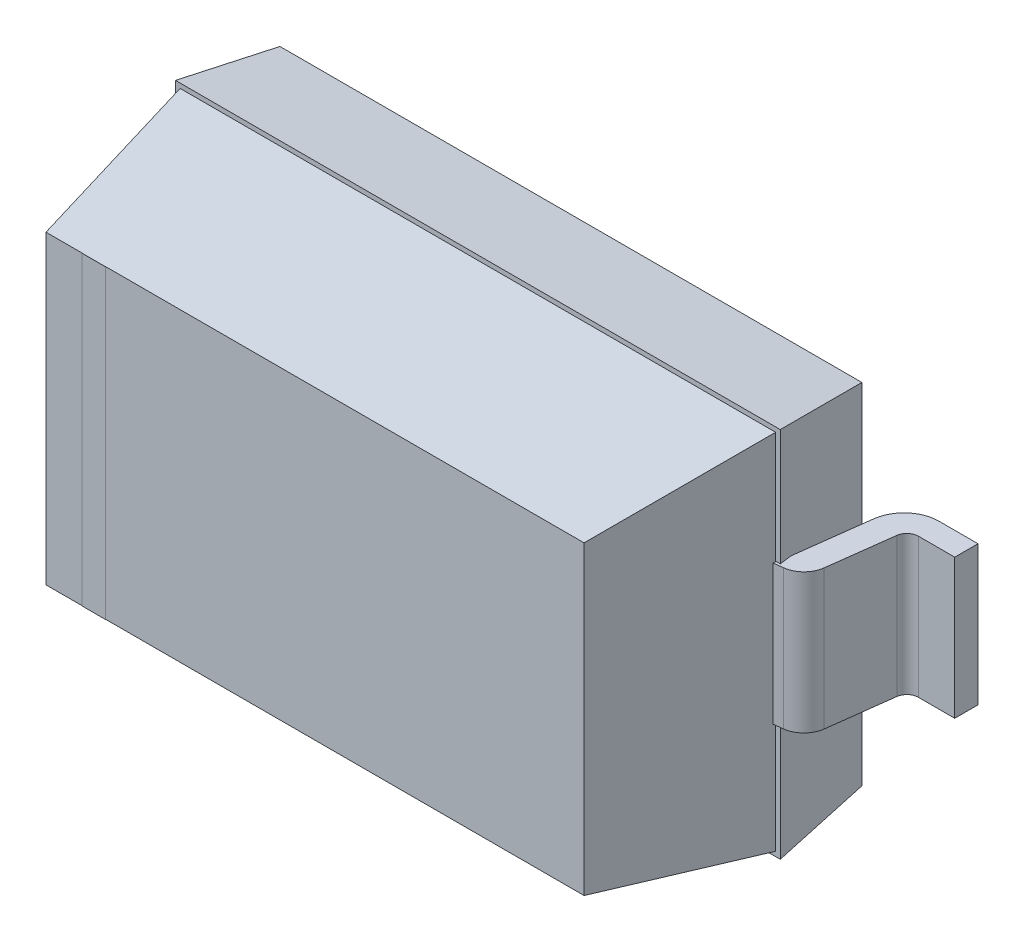
ISO-10303-21;
HEADER;
FILE_DESCRIPTION(('STEP AP214'),'2;1');
FILE_NAME('part.step','',(''),(''),'','','');
FILE_SCHEMA(('AUTOMOTIVE_DESIGN { 1 0 10303 214 1 1 1 1 }'));
ENDSEC;
DATA;
#1=APPLICATION_CONTEXT('core data for automotive mechanical design processes');
#2=APPLICATION_PROTOCOL_DEFINITION('international standard','automotive_design',2000,#1);
#3=PRODUCT_CONTEXT('',#1,'mechanical');
#4=PRODUCT('Part','Part','',(#3));
#5=PRODUCT_RELATED_PRODUCT_CATEGORY('part','',(#4));
#6=PRODUCT_DEFINITION_FORMATION('','',#4);
#7=PRODUCT_DEFINITION_CONTEXT('part definition',#1,'design');
#8=PRODUCT_DEFINITION('design','',#6,#7);
#9=PRODUCT_DEFINITION_SHAPE('','',#8);
#10=(LENGTH_UNIT() NAMED_UNIT(*) SI_UNIT(.MILLI.,.METRE.));
#11=(NAMED_UNIT(*) PLANE_ANGLE_UNIT() SI_UNIT($,.RADIAN.));
#12=(NAMED_UNIT(*) SI_UNIT($,.STERADIAN.) SOLID_ANGLE_UNIT());
#13=UNCERTAINTY_MEASURE_WITH_UNIT(LENGTH_MEASURE(1.E-05),#10,'distance_accuracy_value','');
#14=(GEOMETRIC_REPRESENTATION_CONTEXT(3) GLOBAL_UNCERTAINTY_ASSIGNED_CONTEXT((#13)) GLOBAL_UNIT_ASSIGNED_CONTEXT((#10,
#11,#12)) REPRESENTATION_CONTEXT('',''));
#15=CARTESIAN_POINT('',(0.,0.,0.));
#16=DIRECTION('',(0.,0.,1.));
#17=DIRECTION('',(1.,0.,0.));
#18=AXIS2_PLACEMENT_3D('',#15,#16,#17);
#19=CARTESIAN_POINT('',(-1.,-0.656571113504074,1.201));
#20=DIRECTION('',(0.,0.,-1.));
#21=DIRECTION('',(-1.,0.,0.));
#22=AXIS2_PLACEMENT_3D('',#19,#20,#21);
#23=PLANE('',#22);
#24=DIRECTION('',(0.,1.,0.));
#25=VECTOR('',#24,1.);
#26=CARTESIAN_POINT('',(-0.9,0.656571113504074,1.201));
#27=LINE('',#26,#25);
#28=CARTESIAN_POINT('',(-0.9,0.656571113504074,1.201));
#29=VERTEX_POINT('',#28);
#30=CARTESIAN_POINT('',(-0.9,-0.656571113504074,1.201));
#31=VERTEX_POINT('',#30);
#32=EDGE_CURVE('E225',#29,#31,#27,.F.);
#33=ORIENTED_EDGE('',*,*,#32,.F.);
#34=DIRECTION('',(-1.,0.,0.));
#35=VECTOR('',#34,1.);
#36=CARTESIAN_POINT('',(-1.,0.656571113504074,1.201));
#37=LINE('',#36,#35);
#38=CARTESIAN_POINT('',(-1.,0.656571113504074,1.201));
#39=VERTEX_POINT('',#38);
#40=EDGE_CURVE('E226',#39,#29,#37,.F.);
#41=ORIENTED_EDGE('',*,*,#40,.F.);
#42=DIRECTION('',(0.,1.,0.));
#43=VECTOR('',#42,1.);
#44=CARTESIAN_POINT('',(-1.,-0.656571113504074,1.201));
#45=LINE('',#44,#43);
#46=CARTESIAN_POINT('',(-1.,-0.656571113504074,1.201));
#47=VERTEX_POINT('',#46);
#48=EDGE_CURVE('E185',#47,#39,#45,.T.);
#49=ORIENTED_EDGE('',*,*,#48,.F.);
#50=DIRECTION('',(-1.,0.,0.));
#51=VECTOR('',#50,1.);
#52=CARTESIAN_POINT('',(-1.,-0.656571113504074,1.201));
#53=LINE('',#52,#51);
#54=EDGE_CURVE('E181',#31,#47,#53,.T.);
#55=ORIENTED_EDGE('',*,*,#54,.F.);
#56=EDGE_LOOP('',(#33,#41,#49,#55));
#57=FACE_BOUND('',#56,.T.);
#58=ADVANCED_FACE('F16',(#57),#23,.F.);
#59=CARTESIAN_POINT('',(-1.,-0.656571113504074,1.201));
#60=DIRECTION('',(-1.,0.,0.));
#61=DIRECTION('',(0.,0.,1.));
#62=AXIS2_PLACEMENT_3D('',#59,#60,#61);
#63=PLANE('',#62);
#64=ORIENTED_EDGE('',*,*,#48,.T.);
#65=DIRECTION('',(0.,0.,1.));
#66=VECTOR('',#65,1.);
#67=CARTESIAN_POINT('',(-1.,0.656571113504074,1.201));
#68=LINE('',#67,#66);
#69=CARTESIAN_POINT('',(-1.,0.656571113504074,1.2));
#70=VERTEX_POINT('',#69);
#71=EDGE_CURVE('E190',#70,#39,#68,.T.);
#72=ORIENTED_EDGE('',*,*,#71,.F.);
#73=DIRECTION('',(0.,1.,0.));
#74=VECTOR('',#73,1.);
#75=CARTESIAN_POINT('',(-1.,-0.78,1.2));
#76=LINE('',#75,#74);
#77=CARTESIAN_POINT('',(-1.,-0.656571113504074,1.2));
#78=VERTEX_POINT('',#77);
#79=EDGE_CURVE('E187',#70,#78,#76,.F.);
#80=ORIENTED_EDGE('',*,*,#79,.T.);
#81=DIRECTION('',(0.,0.,1.));
#82=VECTOR('',#81,1.);
#83=CARTESIAN_POINT('',(-1.,-0.656571113504074,1.201));
#84=LINE('',#83,#82);
#85=EDGE_CURVE('E19',#78,#47,#84,.T.);
#86=ORIENTED_EDGE('',*,*,#85,.T.);
#87=EDGE_LOOP('',(#64,#72,#80,#86));
#88=FACE_BOUND('',#87,.T.);
#89=ADVANCED_FACE('F188',(#88),#63,.T.);
#90=CARTESIAN_POINT('',(-0.9,0.656571113504074,1.201));
#91=DIRECTION('',(1.,0.,0.));
#92=DIRECTION('',(0.,0.,-1.));
#93=AXIS2_PLACEMENT_3D('',#90,#91,#92);
#94=PLANE('',#93);
#95=ORIENTED_EDGE('',*,*,#32,.T.);
#96=DIRECTION('',(0.,0.,-1.));
#97=VECTOR('',#96,1.);
#98=CARTESIAN_POINT('',(-0.9,-0.656571113504074,1.201));
#99=LINE('',#98,#97);
#100=CARTESIAN_POINT('',(-0.9,-0.656571113504074,1.2));
#101=VERTEX_POINT('',#100);
#102=EDGE_CURVE('E256',#31,#101,#99,.T.);
#103=ORIENTED_EDGE('',*,*,#102,.T.);
#104=DIRECTION('',(0.,1.,0.));
#105=VECTOR('',#104,1.);
#106=CARTESIAN_POINT('',(-0.9,-0.78,1.2));
#107=LINE('',#106,#105);
#108=CARTESIAN_POINT('',(-0.9,0.656571113504074,1.2));
#109=VERTEX_POINT('',#108);
#110=EDGE_CURVE('E212',#101,#109,#107,.T.);
#111=ORIENTED_EDGE('',*,*,#110,.T.);
#112=DIRECTION('',(0.,0.,1.));
#113=VECTOR('',#112,1.);
#114=CARTESIAN_POINT('',(-0.9,0.656571113504074,1.201));
#115=LINE('',#114,#113);
#116=EDGE_CURVE('E195',#29,#109,#115,.F.);
#117=ORIENTED_EDGE('',*,*,#116,.F.);
#118=EDGE_LOOP('',(#95,#103,#111,#117));
#119=FACE_BOUND('',#118,.T.);
#120=ADVANCED_FACE('F431',(#119),#94,.T.);
#121=CARTESIAN_POINT('',(-1.,0.656571113504074,1.201));
#122=DIRECTION('',(0.,1.,0.));
#123=DIRECTION('',(0.,0.,1.));
#124=AXIS2_PLACEMENT_3D('',#121,#122,#123);
#125=PLANE('',#124);
#126=ORIENTED_EDGE('',*,*,#40,.T.);
#127=ORIENTED_EDGE('',*,*,#116,.T.);
#128=DIRECTION('',(1.,0.,0.));
#129=VECTOR('',#128,1.);
#130=CARTESIAN_POINT('',(0.,0.656571113504075,1.2));
#131=LINE('',#130,#129);
#132=EDGE_CURVE('E283',#70,#109,#131,.T.);
#133=ORIENTED_EDGE('',*,*,#132,.F.);
#134=ORIENTED_EDGE('',*,*,#71,.T.);
#135=EDGE_LOOP('',(#126,#127,#133,#134));
#136=FACE_BOUND('',#135,.T.);
#137=ADVANCED_FACE('F435',(#136),#125,.T.);
#138=CARTESIAN_POINT('',(-1.28,-0.78,1.2));
#139=DIRECTION('',(0.,0.,-1.));
#140=DIRECTION('',(-1.,0.,0.));
#141=AXIS2_PLACEMENT_3D('',#138,#139,#140);
#142=PLANE('',#141);
#143=ORIENTED_EDGE('',*,*,#79,.F.);
#144=DIRECTION('',(1.,0.,0.));
#145=VECTOR('',#144,1.);
#146=CARTESIAN_POINT('',(0.,0.656571113504075,1.2));
#147=LINE('',#146,#145);
#148=CARTESIAN_POINT('',(-1.15657111350407,0.656571113504075,1.2));
#149=VERTEX_POINT('',#148);
#150=EDGE_CURVE('E280',#149,#70,#147,.T.);
#151=ORIENTED_EDGE('',*,*,#150,.F.);
#152=DIRECTION('',(0.,1.,0.));
#153=VECTOR('',#152,1.);
#154=CARTESIAN_POINT('',(-1.15657111350407,0.,1.2));
#155=LINE('',#154,#153);
#156=CARTESIAN_POINT('',(-1.15657111350407,-0.656571113504074,1.2));
#157=VERTEX_POINT('',#156);
#158=EDGE_CURVE('E208',#157,#149,#155,.T.);
#159=ORIENTED_EDGE('',*,*,#158,.F.);
#160=DIRECTION('',(-1.,0.,0.));
#161=VECTOR('',#160,1.);
#162=CARTESIAN_POINT('',(-1.28,-0.656571113504074,1.2));
#163=LINE('',#162,#161);
#164=EDGE_CURVE('E194',#78,#157,#163,.T.);
#165=ORIENTED_EDGE('',*,*,#164,.F.);
#166=EDGE_LOOP('',(#143,#151,#159,#165));
#167=FACE_BOUND('',#166,.T.);
#168=ADVANCED_FACE('F206',(#167),#142,.F.);
#169=CARTESIAN_POINT('',(-1.28,-0.78,1.2));
#170=DIRECTION('',(0.,0.,-1.));
#171=DIRECTION('',(-1.,0.,0.));
#172=AXIS2_PLACEMENT_3D('',#169,#170,#171);
#173=PLANE('',#172);
#174=ORIENTED_EDGE('',*,*,#110,.F.);
#175=DIRECTION('',(1.,0.,0.));
#176=VECTOR('',#175,1.);
#177=CARTESIAN_POINT('',(0.,-0.656571113504075,1.2));
#178=LINE('',#177,#176);
#179=CARTESIAN_POINT('',(1.15657111350407,-0.656571113504075,1.2));
#180=VERTEX_POINT('',#179);
#181=EDGE_CURVE('E203',#180,#101,#178,.F.);
#182=ORIENTED_EDGE('',*,*,#181,.F.);
#183=DIRECTION('',(0.,1.,0.));
#184=VECTOR('',#183,1.);
#185=CARTESIAN_POINT('',(1.15657111350407,-0.78,1.2));
#186=LINE('',#185,#184);
#187=CARTESIAN_POINT('',(1.15657111350407,0.656571113504074,1.2));
#188=VERTEX_POINT('',#187);
#189=EDGE_CURVE('E210',#188,#180,#186,.F.);
#190=ORIENTED_EDGE('',*,*,#189,.F.);
#191=DIRECTION('',(1.,0.,0.));
#192=VECTOR('',#191,1.);
#193=CARTESIAN_POINT('',(0.,0.656571113504075,1.2));
#194=LINE('',#193,#192);
#195=EDGE_CURVE('E289',#109,#188,#194,.T.);
#196=ORIENTED_EDGE('',*,*,#195,.F.);
#197=EDGE_LOOP('',(#174,#182,#190,#196));
#198=FACE_BOUND('',#197,.T.);
#199=ADVANCED_FACE('F436',(#198),#173,.F.);
#200=CARTESIAN_POINT('',(-0.9,-0.656571113504074,1.201));
#201=DIRECTION('',(0.,-1.,0.));
#202=DIRECTION('',(0.,0.,-1.));
#203=AXIS2_PLACEMENT_3D('',#200,#201,#202);
#204=PLANE('',#203);
#205=ORIENTED_EDGE('',*,*,#54,.T.);
#206=ORIENTED_EDGE('',*,*,#85,.F.);
#207=DIRECTION('',(1.,0.,0.));
#208=VECTOR('',#207,1.);
#209=CARTESIAN_POINT('',(0.,-0.656571113504075,1.2));
#210=LINE('',#209,#208);
#211=EDGE_CURVE('E179',#101,#78,#210,.F.);
#212=ORIENTED_EDGE('',*,*,#211,.F.);
#213=ORIENTED_EDGE('',*,*,#102,.F.);
#214=EDGE_LOOP('',(#205,#206,#212,#213));
#215=FACE_BOUND('',#214,.T.);
#216=ADVANCED_FACE('F176',(#215),#204,.T.);
#217=CARTESIAN_POINT('',(1.65,-0.3,0.0999999999999998));
#218=DIRECTION('',(1.,0.,0.));
#219=DIRECTION('',(0.,0.,-1.));
#220=AXIS2_PLACEMENT_3D('',#217,#218,#219);
#221=PLANE('',#220);
#222=DIRECTION('',(0.,0.,1.));
#223=VECTOR('',#222,1.);
#224=CARTESIAN_POINT('',(1.65,-0.3,0.15));
#225=LINE('',#224,#223);
#226=CARTESIAN_POINT('',(1.65,-0.3,0.0999999999999999));
#227=VERTEX_POINT('',#226);
#228=CARTESIAN_POINT('',(1.65,-0.3,0.));
#229=VERTEX_POINT('',#228);
#230=EDGE_CURVE('E340',#227,#229,#225,.F.);
#231=ORIENTED_EDGE('',*,*,#230,.T.);
#232=DIRECTION('',(0.,1.,0.));
#233=VECTOR('',#232,1.);
#234=CARTESIAN_POINT('',(1.65,-0.3,0.));
#235=LINE('',#234,#233);
#236=CARTESIAN_POINT('',(1.65,0.3,0.));
#237=VERTEX_POINT('',#236);
#238=EDGE_CURVE('E407',#237,#229,#235,.F.);
#239=ORIENTED_EDGE('',*,*,#238,.F.);
#240=DIRECTION('',(0.,0.,1.));
#241=VECTOR('',#240,1.);
#242=CARTESIAN_POINT('',(1.65,0.3,0.15));
#243=LINE('',#242,#241);
#244=CARTESIAN_POINT('',(1.65,0.3,0.0999999999999999));
#245=VERTEX_POINT('',#244);
#246=EDGE_CURVE('E334',#245,#237,#243,.F.);
#247=ORIENTED_EDGE('',*,*,#246,.F.);
#248=DIRECTION('',(0.,1.,0.));
#249=VECTOR('',#248,1.);
#250=CARTESIAN_POINT('',(1.65,-0.3,0.0999999999999998));
#251=LINE('',#250,#249);
#252=EDGE_CURVE('E284',#227,#245,#251,.T.);
#253=ORIENTED_EDGE('',*,*,#252,.F.);
#254=EDGE_LOOP('',(#231,#239,#247,#253));
#255=FACE_BOUND('',#254,.T.);
#256=ADVANCED_FACE('F512',(#255),#221,.T.);
#257=CARTESIAN_POINT('',(1.6,-0.3,0.));
#258=DIRECTION('',(0.,0.,-1.));
#259=DIRECTION('',(-1.,0.,0.));
#260=AXIS2_PLACEMENT_3D('',#257,#258,#259);
#261=PLANE('',#260);
#262=DIRECTION('',(1.,0.,0.));
#263=VECTOR('',#262,1.);
#264=CARTESIAN_POINT('',(1.48213745767196,-0.3,0.));
#265=LINE('',#264,#263);
#266=CARTESIAN_POINT('',(1.48213745767196,-0.3,0.));
#267=VERTEX_POINT('',#266);
#268=EDGE_CURVE('E337',#229,#267,#265,.F.);
#269=ORIENTED_EDGE('',*,*,#268,.T.);
#270=DIRECTION('',(0.,-1.,0.));
#271=VECTOR('',#270,1.);
#272=CARTESIAN_POINT('',(1.48213745767196,-0.3,0.));
#273=LINE('',#272,#271);
#274=CARTESIAN_POINT('',(1.48213745767196,0.3,0.));
#275=VERTEX_POINT('',#274);
#276=EDGE_CURVE('E374',#275,#267,#273,.T.);
#277=ORIENTED_EDGE('',*,*,#276,.F.);
#278=DIRECTION('',(1.,0.,0.));
#279=VECTOR('',#278,1.);
#280=CARTESIAN_POINT('',(1.48213745767196,0.3,0.));
#281=LINE('',#280,#279);
#282=EDGE_CURVE('E242',#237,#275,#281,.F.);
#283=ORIENTED_EDGE('',*,*,#282,.F.);
#284=ORIENTED_EDGE('',*,*,#238,.T.);
#285=EDGE_LOOP('',(#269,#277,#283,#284));
#286=FACE_BOUND('',#285,.T.);
#287=ADVANCED_FACE('F510',(#286),#261,.T.);
#288=CARTESIAN_POINT('',(1.48213745767196,-0.3,0.15));
#289=DIRECTION('',(0.,-1.,0.));
#290=DIRECTION('',(0.,0.,-1.));
#291=AXIS2_PLACEMENT_3D('',#288,#289,#290);
#292=CYLINDRICAL_SURFACE('',#291,0.15);
#293=CARTESIAN_POINT('',(1.48213745767196,-0.3,0.15));
#294=DIRECTION('',(0.,-1.,0.));
#295=DIRECTION('',(0.,0.,-1.));
#296=AXIS2_PLACEMENT_3D('',#293,#294,#295);
#297=CIRCLE('',#296,0.15);
#298=CARTESIAN_POINT('',(1.33333516022967,-0.3,0.131082381865134));
#299=VERTEX_POINT('',#298);
#300=EDGE_CURVE('E250',#267,#299,#297,.F.);
#301=ORIENTED_EDGE('',*,*,#300,.T.);
#302=DIRECTION('',(0.,1.,0.));
#303=VECTOR('',#302,1.);
#304=CARTESIAN_POINT('',(1.33333516022967,-0.3,0.131082381865135));
#305=LINE('',#304,#303);
#306=CARTESIAN_POINT('',(1.33333516022967,0.3,0.131082381865134));
#307=VERTEX_POINT('',#306);
#308=EDGE_CURVE('E253',#307,#299,#305,.F.);
#309=ORIENTED_EDGE('',*,*,#308,.F.);
#310=CARTESIAN_POINT('',(1.48213745767196,0.3,0.15));
#311=DIRECTION('',(0.,-1.,0.));
#312=DIRECTION('',(0.,0.,-1.));
#313=AXIS2_PLACEMENT_3D('',#310,#311,#312);
#314=CIRCLE('',#313,0.15);
#315=EDGE_CURVE('E238',#275,#307,#314,.F.);
#316=ORIENTED_EDGE('',*,*,#315,.F.);
#317=ORIENTED_EDGE('',*,*,#276,.T.);
#318=EDGE_LOOP('',(#301,#309,#316,#317));
#319=FACE_BOUND('',#318,.T.);
#320=ADVANCED_FACE('F506',(#319),#292,.T.);
#321=CARTESIAN_POINT('',(1.3,-0.3,0.51));
#322=DIRECTION('',(0.12186934340515,0.,0.992546151641322));
#323=DIRECTION('',(0.992546151641322,0.,-0.12186934340515));
#324=AXIS2_PLACEMENT_3D('',#321,#322,#323);
#325=PLANE('',#324);
#326=DIRECTION('',(0.992546151641321,0.,-0.121869343405155));
#327=VECTOR('',#326,1.);
#328=CARTESIAN_POINT('',(1.28165492490586,-0.3,0.512252491990165));
#329=LINE('',#328,#327);
#330=CARTESIAN_POINT('',(1.28165492490586,-0.3,0.512252491990165));
#331=VERTEX_POINT('',#330);
#332=CARTESIAN_POINT('',(1.32208355744871,-0.3,0.507288480095486));
#333=VERTEX_POINT('',#332);
#334=EDGE_CURVE('E249',#331,#333,#329,.T.);
#335=ORIENTED_EDGE('',*,*,#334,.T.);
#336=DIRECTION('',(0.,-1.,0.));
#337=VECTOR('',#336,1.);
#338=CARTESIAN_POINT('',(1.32208355744871,-0.3,0.507288480095486));
#339=LINE('',#338,#337);
#340=CARTESIAN_POINT('',(1.32208355744871,0.3,0.507288480095486));
#341=VERTEX_POINT('',#340);
#342=EDGE_CURVE('E371',#341,#333,#339,.T.);
#343=ORIENTED_EDGE('',*,*,#342,.F.);
#344=DIRECTION('',(0.992546151641321,0.,-0.121869343405155));
#345=VECTOR('',#344,1.);
#346=CARTESIAN_POINT('',(1.28165492490586,0.3,0.512252491990165));
#347=LINE('',#346,#345);
#348=CARTESIAN_POINT('',(1.28165492490586,0.3,0.512252491990165));
#349=VERTEX_POINT('',#348);
#350=EDGE_CURVE('E237',#349,#341,#347,.T.);
#351=ORIENTED_EDGE('',*,*,#350,.F.);
#352=DIRECTION('',(0.,1.,0.));
#353=VECTOR('',#352,1.);
#354=CARTESIAN_POINT('',(1.28165492490586,-0.3,0.512252491990165));
#355=LINE('',#354,#353);
#356=EDGE_CURVE('E271',#331,#349,#355,.T.);
#357=ORIENTED_EDGE('',*,*,#356,.F.);
#358=EDGE_LOOP('',(#335,#343,#351,#357));
#359=FACE_BOUND('',#358,.T.);
#360=ADVANCED_FACE('F531',(#359),#325,.T.);
#361=CARTESIAN_POINT('',(1.30989662310819,-0.3,0.408033864931354));
#362=DIRECTION('',(0.,-1.,0.));
#363=DIRECTION('',(0.,0.,-1.));
#364=AXIS2_PLACEMENT_3D('',#361,#362,#363);
#365=CYLINDRICAL_SURFACE('',#364,0.1);
#366=CARTESIAN_POINT('',(1.30989662310819,-0.3,0.408033864931354));
#367=DIRECTION('',(0.,-1.,0.));
#368=DIRECTION('',(0.,0.,-1.));
#369=AXIS2_PLACEMENT_3D('',#366,#367,#368);
#370=CIRCLE('',#369,0.1);
#371=CARTESIAN_POINT('',(1.40909283035833,-0.3,0.420687420446988));
#372=VERTEX_POINT('',#371);
#373=EDGE_CURVE('E247',#333,#372,#370,.F.);
#374=ORIENTED_EDGE('',*,*,#373,.T.);
#375=DIRECTION('',(0.,1.,0.));
#376=VECTOR('',#375,1.);
#377=CARTESIAN_POINT('',(1.40909283035833,-0.3,0.420687420446988));
#378=LINE('',#377,#376);
#379=CARTESIAN_POINT('',(1.40909283035833,0.3,0.420687420446988));
#380=VERTEX_POINT('',#379);
#381=EDGE_CURVE('E368',#380,#372,#378,.F.);
#382=ORIENTED_EDGE('',*,*,#381,.F.);
#383=CARTESIAN_POINT('',(1.30989662310819,0.3,0.408033864931354));
#384=DIRECTION('',(0.,-1.,0.));
#385=DIRECTION('',(0.,0.,-1.));
#386=AXIS2_PLACEMENT_3D('',#383,#384,#385);
#387=CIRCLE('',#386,0.1);
#388=EDGE_CURVE('E234',#341,#380,#387,.F.);
#389=ORIENTED_EDGE('',*,*,#388,.F.);
#390=ORIENTED_EDGE('',*,*,#342,.T.);
#391=EDGE_LOOP('',(#374,#382,#389,#390));
#392=FACE_BOUND('',#391,.T.);
#393=ADVANCED_FACE('F528',(#392),#365,.T.);
#394=CARTESIAN_POINT('',(1.40909283035833,-0.3,0.420687420446988));
#395=DIRECTION('',(0.991962072501402,0.,0.126535555156341));
#396=DIRECTION('',(0.126535555156341,0.,-0.991962072501402));
#397=AXIS2_PLACEMENT_3D('',#394,#395,#396);
#398=PLANE('',#397);
#399=DIRECTION('',(0.126535555156347,0.,-0.991962072501401));
#400=VECTOR('',#399,1.);
#401=CARTESIAN_POINT('',(1.40909283035833,-0.3,0.420687420446988));
#402=LINE('',#401,#400);
#403=CARTESIAN_POINT('',(1.44442900532684,-0.3,0.143673222242183));
#404=VERTEX_POINT('',#403);
#405=EDGE_CURVE('E246',#372,#404,#402,.T.);
#406=ORIENTED_EDGE('',*,*,#405,.T.);
#407=DIRECTION('',(0.,-1.,0.));
#408=VECTOR('',#407,1.);
#409=CARTESIAN_POINT('',(1.44442900532684,-0.3,0.143673222242183));
#410=LINE('',#409,#408);
#411=CARTESIAN_POINT('',(1.44442900532684,0.3,0.143673222242183));
#412=VERTEX_POINT('',#411);
#413=EDGE_CURVE('E358',#404,#412,#410,.F.);
#414=ORIENTED_EDGE('',*,*,#413,.T.);
#415=DIRECTION('',(0.126535555156347,0.,-0.991962072501401));
#416=VECTOR('',#415,1.);
#417=CARTESIAN_POINT('',(1.40909283035833,0.3,0.420687420446988));
#418=LINE('',#417,#416);
#419=EDGE_CURVE('E233',#380,#412,#418,.T.);
#420=ORIENTED_EDGE('',*,*,#419,.F.);
#421=ORIENTED_EDGE('',*,*,#381,.T.);
#422=EDGE_LOOP('',(#406,#414,#420,#421));
#423=FACE_BOUND('',#422,.T.);
#424=ADVANCED_FACE('F525',(#423),#398,.T.);
#425=CARTESIAN_POINT('',(1.49402710895191,-0.3,0.15));
#426=DIRECTION('',(0.,-1.,0.));
#427=DIRECTION('',(0.,0.,-1.));
#428=AXIS2_PLACEMENT_3D('',#425,#426,#427);
#429=CYLINDRICAL_SURFACE('',#428,0.05);
#430=ORIENTED_EDGE('',*,*,#413,.F.);
#431=CARTESIAN_POINT('',(1.49402710895191,-0.3,0.15));
#432=DIRECTION('',(0.,-1.,0.));
#433=DIRECTION('',(0.,0.,-1.));
#434=AXIS2_PLACEMENT_3D('',#431,#432,#433);
#435=CIRCLE('',#434,0.05);
#436=CARTESIAN_POINT('',(1.49402710895191,-0.3,0.0999999999999999));
#437=VERTEX_POINT('',#436);
#438=EDGE_CURVE('E243',#404,#437,#435,.T.);
#439=ORIENTED_EDGE('',*,*,#438,.T.);
#440=DIRECTION('',(0.,1.,0.));
#441=VECTOR('',#440,1.);
#442=CARTESIAN_POINT('',(1.49402710895191,-0.3,0.0999999999999998));
#443=LINE('',#442,#441);
#444=CARTESIAN_POINT('',(1.49402710895191,0.3,0.0999999999999999));
#445=VERTEX_POINT('',#444);
#446=EDGE_CURVE('E355',#445,#437,#443,.F.);
#447=ORIENTED_EDGE('',*,*,#446,.F.);
#448=CARTESIAN_POINT('',(1.49402710895191,0.3,0.15));
#449=DIRECTION('',(0.,-1.,0.));
#450=DIRECTION('',(0.,0.,-1.));
#451=AXIS2_PLACEMENT_3D('',#448,#449,#450);
#452=CIRCLE('',#451,0.05);
#453=EDGE_CURVE('E229',#412,#445,#452,.T.);
#454=ORIENTED_EDGE('',*,*,#453,.F.);
#455=EDGE_LOOP('',(#430,#439,#447,#454));
#456=FACE_BOUND('',#455,.T.);
#457=ADVANCED_FACE('F521',(#456),#429,.F.);
#458=CARTESIAN_POINT('',(1.6,-0.3,0.0999999999999998));
#459=DIRECTION('',(0.,0.,1.));
#460=DIRECTION('',(1.,0.,0.));
#461=AXIS2_PLACEMENT_3D('',#458,#459,#460);
#462=PLANE('',#461);
#463=DIRECTION('',(1.,0.,0.));
#464=VECTOR('',#463,1.);
#465=CARTESIAN_POINT('',(1.48213745767196,-0.3,0.0999999999999999));
#466=LINE('',#465,#464);
#467=EDGE_CURVE('E245',#437,#227,#466,.T.);
#468=ORIENTED_EDGE('',*,*,#467,.T.);
#469=ORIENTED_EDGE('',*,*,#252,.T.);
#470=DIRECTION('',(1.,0.,0.));
#471=VECTOR('',#470,1.);
#472=CARTESIAN_POINT('',(1.48213745767196,0.3,0.0999999999999999));
#473=LINE('',#472,#471);
#474=EDGE_CURVE('E232',#445,#245,#473,.T.);
#475=ORIENTED_EDGE('',*,*,#474,.F.);
#476=ORIENTED_EDGE('',*,*,#446,.T.);
#477=EDGE_LOOP('',(#468,#469,#475,#476));
#478=FACE_BOUND('',#477,.T.);
#479=ADVANCED_FACE('F515',(#478),#462,.T.);
#480=CARTESIAN_POINT('',(0.,0.78,0.5));
#481=DIRECTION('',(0.,0.984807753012208,0.17364817766693));
#482=DIRECTION('',(0.,-0.17364817766693,0.984807753012208));
#483=AXIS2_PLACEMENT_3D('',#480,#481,#482);
#484=PLANE('',#483);
#485=ORIENTED_EDGE('',*,*,#195,.T.);
#486=DIRECTION('',(-0.171087869746035,-0.171087869746036,0.970287525247814));
#487=VECTOR('',#486,1.);
#488=CARTESIAN_POINT('',(1.28,0.780000000000001,0.5));
#489=LINE('',#488,#487);
#490=CARTESIAN_POINT('',(1.28,0.78,0.5));
#491=VERTEX_POINT('',#490);
#492=EDGE_CURVE('E221',#491,#188,#489,.T.);
#493=ORIENTED_EDGE('',*,*,#492,.F.);
#494=DIRECTION('',(-1.,0.,0.));
#495=VECTOR('',#494,1.);
#496=CARTESIAN_POINT('',(-1.3,0.78,0.5));
#497=LINE('',#496,#495);
#498=CARTESIAN_POINT('',(-1.28,0.78,0.5));
#499=VERTEX_POINT('',#498);
#500=EDGE_CURVE('E312',#491,#499,#497,.T.);
#501=ORIENTED_EDGE('',*,*,#500,.T.);
#502=DIRECTION('',(-0.171087869746035,0.171087869746036,-0.970287525247814));
#503=VECTOR('',#502,1.);
#504=CARTESIAN_POINT('',(-1.15657111350407,0.656571113504074,1.2));
#505=LINE('',#504,#503);
#506=EDGE_CURVE('E294',#149,#499,#505,.T.);
#507=ORIENTED_EDGE('',*,*,#506,.F.);
#508=ORIENTED_EDGE('',*,*,#150,.T.);
#509=ORIENTED_EDGE('',*,*,#132,.T.);
#510=EDGE_LOOP('',(#485,#493,#501,#507,#508,#509));
#511=FACE_BOUND('',#510,.T.);
#512=ADVANCED_FACE('F438',(#511),#484,.T.);
#513=CARTESIAN_POINT('',(-1.28,0.,0.5));
#514=DIRECTION('',(-0.984807753012208,0.,0.17364817766693));
#515=DIRECTION('',(0.17364817766693,0.,0.984807753012208));
#516=AXIS2_PLACEMENT_3D('',#513,#514,#515);
#517=PLANE('',#516);
#518=ORIENTED_EDGE('',*,*,#158,.T.);
#519=ORIENTED_EDGE('',*,*,#506,.T.);
#520=DIRECTION('',(0.,1.,0.));
#521=VECTOR('',#520,1.);
#522=CARTESIAN_POINT('',(-1.28,0.8,0.5));
#523=LINE('',#522,#521);
#524=CARTESIAN_POINT('',(-1.28,-0.78,0.5));
#525=VERTEX_POINT('',#524);
#526=EDGE_CURVE('E302',#499,#525,#523,.F.);
#527=ORIENTED_EDGE('',*,*,#526,.T.);
#528=DIRECTION('',(-0.171087869746042,-0.171087869746035,-0.970287525247813));
#529=VECTOR('',#528,1.);
#530=CARTESIAN_POINT('',(-1.15657111350407,-0.656571113504075,1.2));
#531=LINE('',#530,#529);
#532=EDGE_CURVE('E204',#157,#525,#531,.T.);
#533=ORIENTED_EDGE('',*,*,#532,.F.);
#534=EDGE_LOOP('',(#518,#519,#527,#533));
#535=FACE_BOUND('',#534,.T.);
#536=ADVANCED_FACE('F299',(#535),#517,.T.);
#537=CARTESIAN_POINT('',(0.,-0.78,0.5));
#538=DIRECTION('',(0.,-0.984807753012208,0.17364817766693));
#539=DIRECTION('',(0.,-0.17364817766693,-0.984807753012208));
#540=AXIS2_PLACEMENT_3D('',#537,#538,#539);
#541=PLANE('',#540);
#542=ORIENTED_EDGE('',*,*,#164,.T.);
#543=ORIENTED_EDGE('',*,*,#532,.T.);
#544=DIRECTION('',(-1.,0.,0.));
#545=VECTOR('',#544,1.);
#546=CARTESIAN_POINT('',(-1.3,-0.78,0.5));
#547=LINE('',#546,#545);
#548=CARTESIAN_POINT('',(1.28,-0.78,0.5));
#549=VERTEX_POINT('',#548);
#550=EDGE_CURVE('E304',#525,#549,#547,.F.);
#551=ORIENTED_EDGE('',*,*,#550,.T.);
#552=DIRECTION('',(0.171087869746035,-0.171087869746036,-0.970287525247814));
#553=VECTOR('',#552,1.);
#554=CARTESIAN_POINT('',(1.15657111350407,-0.656571113504074,1.2));
#555=LINE('',#554,#553);
#556=EDGE_CURVE('E267',#180,#549,#555,.T.);
#557=ORIENTED_EDGE('',*,*,#556,.F.);
#558=ORIENTED_EDGE('',*,*,#181,.T.);
#559=ORIENTED_EDGE('',*,*,#211,.T.);
#560=EDGE_LOOP('',(#542,#543,#551,#557,#558,#559));
#561=FACE_BOUND('',#560,.T.);
#562=ADVANCED_FACE('F198',(#561),#541,.T.);
#563=CARTESIAN_POINT('',(1.28,0.,0.5));
#564=DIRECTION('',(0.984807753012208,0.,0.17364817766693));
#565=DIRECTION('',(0.17364817766693,0.,-0.984807753012208));
#566=AXIS2_PLACEMENT_3D('',#563,#564,#565);
#567=PLANE('',#566);
#568=ORIENTED_EDGE('',*,*,#189,.T.);
#569=ORIENTED_EDGE('',*,*,#556,.T.);
#570=DIRECTION('',(0.,1.,0.));
#571=VECTOR('',#570,1.);
#572=CARTESIAN_POINT('',(1.28,0.8,0.5));
#573=LINE('',#572,#571);
#574=EDGE_CURVE('E308',#549,#491,#573,.T.);
#575=ORIENTED_EDGE('',*,*,#574,.T.);
#576=ORIENTED_EDGE('',*,*,#492,.T.);
#577=EDGE_LOOP('',(#568,#569,#575,#576));
#578=FACE_BOUND('',#577,.T.);
#579=ADVANCED_FACE('F439',(#578),#567,.T.);
#580=CARTESIAN_POINT('',(1.28165492490586,-0.3,0.5));
#581=DIRECTION('',(-1.,0.,0.));
#582=DIRECTION('',(0.,0.,1.));
#583=AXIS2_PLACEMENT_3D('',#580,#581,#582);
#584=PLANE('',#583);
#585=DIRECTION('',(0.,0.,1.));
#586=VECTOR('',#585,1.);
#587=CARTESIAN_POINT('',(1.28165492490586,-0.3,0.15));
#588=LINE('',#587,#586);
#589=CARTESIAN_POINT('',(1.28165492490586,-0.3,0.5));
#590=VERTEX_POINT('',#589);
#591=EDGE_CURVE('E349',#590,#331,#588,.T.);
#592=ORIENTED_EDGE('',*,*,#591,.T.);
#593=ORIENTED_EDGE('',*,*,#356,.T.);
#594=DIRECTION('',(0.,0.,1.));
#595=VECTOR('',#594,1.);
#596=CARTESIAN_POINT('',(1.28165492490586,0.3,0.15));
#597=LINE('',#596,#595);
#598=CARTESIAN_POINT('',(1.28165492490586,0.3,0.5));
#599=VERTEX_POINT('',#598);
#600=EDGE_CURVE('E325',#599,#349,#597,.T.);
#601=ORIENTED_EDGE('',*,*,#600,.F.);
#602=DIRECTION('',(0.,1.,0.));
#603=VECTOR('',#602,1.);
#604=CARTESIAN_POINT('',(1.28165492490586,0.8,0.5));
#605=LINE('',#604,#603);
#606=EDGE_CURVE('E383',#599,#590,#605,.F.);
#607=ORIENTED_EDGE('',*,*,#606,.T.);
#608=EDGE_LOOP('',(#592,#593,#601,#607));
#609=FACE_BOUND('',#608,.T.);
#610=ADVANCED_FACE('F441',(#609),#584,.T.);
#611=CARTESIAN_POINT('',(1.33333516022967,-0.3,0.131082381865135));
#612=DIRECTION('',(-0.992015316281926,0.,-0.126117454232434));
#613=DIRECTION('',(-0.126117454232434,0.,0.992015316281926));
#614=AXIS2_PLACEMENT_3D('',#611,#612,#613);
#615=PLANE('',#614);
#616=DIRECTION('',(-0.126117454232452,0.,0.992015316281924));
#617=VECTOR('',#616,1.);
#618=CARTESIAN_POINT('',(1.33333516022967,-0.3,0.131082381865135));
#619=LINE('',#618,#617);
#620=CARTESIAN_POINT('',(1.29333486981038,-0.3,0.4457168707482));
#621=VERTEX_POINT('',#620);
#622=EDGE_CURVE('E252',#299,#621,#619,.T.);
#623=ORIENTED_EDGE('',*,*,#622,.T.);
#624=DIRECTION('',(0.,1.,0.));
#625=VECTOR('',#624,1.);
#626=CARTESIAN_POINT('',(1.29333486981038,0.,0.445716870748201));
#627=LINE('',#626,#625);
#628=CARTESIAN_POINT('',(1.29333486981038,0.3,0.4457168707482));
#629=VERTEX_POINT('',#628);
#630=EDGE_CURVE('E392',#629,#621,#627,.F.);
#631=ORIENTED_EDGE('',*,*,#630,.F.);
#632=DIRECTION('',(-0.126117454232452,0.,0.992015316281924));
#633=VECTOR('',#632,1.);
#634=CARTESIAN_POINT('',(1.33333516022967,0.3,0.131082381865135));
#635=LINE('',#634,#633);
#636=EDGE_CURVE('E241',#307,#629,#635,.T.);
#637=ORIENTED_EDGE('',*,*,#636,.F.);
#638=ORIENTED_EDGE('',*,*,#308,.T.);
#639=EDGE_LOOP('',(#623,#631,#637,#638));
#640=FACE_BOUND('',#639,.T.);
#641=ADVANCED_FACE('F448',(#640),#615,.T.);
#642=CARTESIAN_POINT('',(1.48213745767196,-0.3,0.15));
#643=DIRECTION('',(0.,1.,0.));
#644=DIRECTION('',(0.,0.,1.));
#645=AXIS2_PLACEMENT_3D('',#642,#643,#644);
#646=PLANE('',#645);
#647=ORIENTED_EDGE('',*,*,#230,.F.);
#648=ORIENTED_EDGE('',*,*,#467,.F.);
#649=ORIENTED_EDGE('',*,*,#438,.F.);
#650=ORIENTED_EDGE('',*,*,#405,.F.);
#651=ORIENTED_EDGE('',*,*,#373,.F.);
#652=ORIENTED_EDGE('',*,*,#334,.F.);
#653=ORIENTED_EDGE('',*,*,#591,.F.);
#654=DIRECTION('',(-1.,0.,0.));
#655=VECTOR('',#654,1.);
#656=CARTESIAN_POINT('',(-1.3,-0.3,0.5));
#657=LINE('',#656,#655);
#658=CARTESIAN_POINT('',(1.3,-0.3,0.5));
#659=VERTEX_POINT('',#658);
#660=EDGE_CURVE('E387',#590,#659,#657,.F.);
#661=ORIENTED_EDGE('',*,*,#660,.T.);
#662=DIRECTION('',(-0.121869343405148,0.,-0.992546151641322));
#663=VECTOR('',#662,1.);
#664=CARTESIAN_POINT('',(1.3,-0.3,0.5));
#665=LINE('',#664,#663);
#666=EDGE_CURVE('E395',#621,#659,#665,.F.);
#667=ORIENTED_EDGE('',*,*,#666,.F.);
#668=ORIENTED_EDGE('',*,*,#622,.F.);
#669=ORIENTED_EDGE('',*,*,#300,.F.);
#670=ORIENTED_EDGE('',*,*,#268,.F.);
#671=EDGE_LOOP('',(#647,#648,#649,#650,#651,#652,#653,#661,#667,#668,#669,#670));
#672=FACE_BOUND('',#671,.T.);
#673=ADVANCED_FACE('F481',(#672),#646,.F.);
#674=CARTESIAN_POINT('',(1.48213745767196,0.3,0.15));
#675=DIRECTION('',(0.,1.,0.));
#676=DIRECTION('',(0.,0.,1.));
#677=AXIS2_PLACEMENT_3D('',#674,#675,#676);
#678=PLANE('',#677);
#679=ORIENTED_EDGE('',*,*,#453,.T.);
#680=ORIENTED_EDGE('',*,*,#474,.T.);
#681=ORIENTED_EDGE('',*,*,#246,.T.);
#682=ORIENTED_EDGE('',*,*,#282,.T.);
#683=ORIENTED_EDGE('',*,*,#315,.T.);
#684=ORIENTED_EDGE('',*,*,#636,.T.);
#685=DIRECTION('',(-0.121869343405148,0.,-0.992546151641322));
#686=VECTOR('',#685,1.);
#687=CARTESIAN_POINT('',(1.3,0.3,0.5));
#688=LINE('',#687,#686);
#689=CARTESIAN_POINT('',(1.3,0.3,0.5));
#690=VERTEX_POINT('',#689);
#691=EDGE_CURVE('E399',#690,#629,#688,.T.);
#692=ORIENTED_EDGE('',*,*,#691,.F.);
#693=DIRECTION('',(-1.,0.,0.));
#694=VECTOR('',#693,1.);
#695=CARTESIAN_POINT('',(-1.3,0.3,0.5));
#696=LINE('',#695,#694);
#697=EDGE_CURVE('E310',#690,#599,#696,.T.);
#698=ORIENTED_EDGE('',*,*,#697,.T.);
#699=ORIENTED_EDGE('',*,*,#600,.T.);
#700=ORIENTED_EDGE('',*,*,#350,.T.);
#701=ORIENTED_EDGE('',*,*,#388,.T.);
#702=ORIENTED_EDGE('',*,*,#419,.T.);
#703=EDGE_LOOP('',(#679,#680,#681,#682,#683,#684,#692,#698,#699,#700,#701,#702));
#704=FACE_BOUND('',#703,.T.);
#705=ADVANCED_FACE('F477',(#704),#678,.T.);
#706=CARTESIAN_POINT('',(-1.3,0.8,0.5));
#707=DIRECTION('',(0.,0.,-1.));
#708=DIRECTION('',(-1.,0.,0.));
#709=AXIS2_PLACEMENT_3D('',#706,#707,#708);
#710=PLANE('',#709);
#711=ORIENTED_EDGE('',*,*,#606,.F.);
#712=ORIENTED_EDGE('',*,*,#697,.F.);
#713=DIRECTION('',(0.,1.,0.));
#714=VECTOR('',#713,1.);
#715=CARTESIAN_POINT('',(1.3,0.,0.5));
#716=LINE('',#715,#714);
#717=CARTESIAN_POINT('',(1.3,0.8,0.5));
#718=VERTEX_POINT('',#717);
#719=EDGE_CURVE('E403',#718,#690,#716,.F.);
#720=ORIENTED_EDGE('',*,*,#719,.F.);
#721=DIRECTION('',(1.,0.,0.));
#722=VECTOR('',#721,1.);
#723=CARTESIAN_POINT('',(0.,0.8,0.5));
#724=LINE('',#723,#722);
#725=CARTESIAN_POINT('',(-1.3,0.8,0.5));
#726=VERTEX_POINT('',#725);
#727=EDGE_CURVE('E396',#726,#718,#724,.T.);
#728=ORIENTED_EDGE('',*,*,#727,.F.);
#729=DIRECTION('',(0.,1.,0.));
#730=VECTOR('',#729,1.);
#731=CARTESIAN_POINT('',(-1.3,0.,0.5));
#732=LINE('',#731,#730);
#733=CARTESIAN_POINT('',(-1.3,-0.8,0.5));
#734=VERTEX_POINT('',#733);
#735=EDGE_CURVE('E420',#734,#726,#732,.T.);
#736=ORIENTED_EDGE('',*,*,#735,.F.);
#737=DIRECTION('',(1.,0.,0.));
#738=VECTOR('',#737,1.);
#739=CARTESIAN_POINT('',(0.,-0.8,0.5));
#740=LINE('',#739,#738);
#741=CARTESIAN_POINT('',(1.3,-0.8,0.5));
#742=VERTEX_POINT('',#741);
#743=EDGE_CURVE('E535',#742,#734,#740,.F.);
#744=ORIENTED_EDGE('',*,*,#743,.F.);
#745=DIRECTION('',(0.,1.,0.));
#746=VECTOR('',#745,1.);
#747=CARTESIAN_POINT('',(1.3,0.,0.5));
#748=LINE('',#747,#746);
#749=EDGE_CURVE('E425',#659,#742,#748,.F.);
#750=ORIENTED_EDGE('',*,*,#749,.F.);
#751=ORIENTED_EDGE('',*,*,#660,.F.);
#752=EDGE_LOOP('',(#711,#712,#720,#728,#736,#744,#750,#751));
#753=FACE_BOUND('',#752,.T.);
#754=ORIENTED_EDGE('',*,*,#550,.F.);
#755=ORIENTED_EDGE('',*,*,#526,.F.);
#756=ORIENTED_EDGE('',*,*,#500,.F.);
#757=ORIENTED_EDGE('',*,*,#574,.F.);
#758=EDGE_LOOP('',(#754,#755,#756,#757));
#759=FACE_BOUND('',#758,.T.);
#760=ADVANCED_FACE('F306',(#753,#759),#710,.F.);
#761=CARTESIAN_POINT('',(-1.3,0.,0.5));
#762=DIRECTION('',(-0.992546151641322,0.,-0.121869343405148));
#763=DIRECTION('',(-0.121869343405148,0.,0.992546151641322));
#764=AXIS2_PLACEMENT_3D('',#761,#762,#763);
#765=PLANE('',#764);
#766=DIRECTION('',(0.12097429115135,0.120974291151355,-0.985256536015294));
#767=VECTOR('',#766,1.);
#768=CARTESIAN_POINT('',(-1.3,-0.8,0.5));
#769=LINE('',#768,#767);
#770=CARTESIAN_POINT('',(-1.25088617563884,-0.750886175638838,0.1));
#771=VERTEX_POINT('',#770);
#772=EDGE_CURVE('E402',#734,#771,#769,.T.);
#773=ORIENTED_EDGE('',*,*,#772,.F.);
#774=ORIENTED_EDGE('',*,*,#735,.T.);
#775=DIRECTION('',(-0.12097429115135,0.120974291151355,0.985256536015294));
#776=VECTOR('',#775,1.);
#777=CARTESIAN_POINT('',(-1.25088617563884,0.750886175638838,0.0999999999999999));
#778=LINE('',#777,#776);
#779=CARTESIAN_POINT('',(-1.25088617563884,0.750886175638838,0.1));
#780=VERTEX_POINT('',#779);
#781=EDGE_CURVE('E542',#780,#726,#778,.T.);
#782=ORIENTED_EDGE('',*,*,#781,.F.);
#783=DIRECTION('',(0.,1.,0.));
#784=VECTOR('',#783,1.);
#785=CARTESIAN_POINT('',(-1.25088617563884,0.8,0.1));
#786=LINE('',#785,#784);
#787=EDGE_CURVE('E551',#771,#780,#786,.T.);
#788=ORIENTED_EDGE('',*,*,#787,.F.);
#789=EDGE_LOOP('',(#773,#774,#782,#788));
#790=FACE_BOUND('',#789,.T.);
#791=ADVANCED_FACE('F470',(#790),#765,.T.);
#792=CARTESIAN_POINT('',(0.,0.8,0.5));
#793=DIRECTION('',(0.,0.992546151641322,-0.121869343405148));
#794=DIRECTION('',(0.,0.121869343405148,0.992546151641322));
#795=AXIS2_PLACEMENT_3D('',#792,#793,#794);
#796=PLANE('',#795);
#797=ORIENTED_EDGE('',*,*,#781,.T.);
#798=ORIENTED_EDGE('',*,*,#727,.T.);
#799=DIRECTION('',(0.120974291151355,0.120974291151355,0.985256536015293));
#800=VECTOR('',#799,1.);
#801=CARTESIAN_POINT('',(1.25088617563884,0.750886175638838,0.1));
#802=LINE('',#801,#800);
#803=CARTESIAN_POINT('',(1.25088617563884,0.750886175638838,0.1));
#804=VERTEX_POINT('',#803);
#805=EDGE_CURVE('E536',#804,#718,#802,.T.);
#806=ORIENTED_EDGE('',*,*,#805,.F.);
#807=DIRECTION('',(-1.,0.,0.));
#808=VECTOR('',#807,1.);
#809=CARTESIAN_POINT('',(-1.3,0.750886175638838,0.1));
#810=LINE('',#809,#808);
#811=EDGE_CURVE('E549',#780,#804,#810,.F.);
#812=ORIENTED_EDGE('',*,*,#811,.F.);
#813=EDGE_LOOP('',(#797,#798,#806,#812));
#814=FACE_BOUND('',#813,.T.);
#815=ADVANCED_FACE('F467',(#814),#796,.T.);
#816=CARTESIAN_POINT('',(1.3,0.,0.5));
#817=DIRECTION('',(0.992546151641322,0.,-0.121869343405148));
#818=DIRECTION('',(-0.121869343405148,0.,-0.992546151641322));
#819=AXIS2_PLACEMENT_3D('',#816,#817,#818);
#820=PLANE('',#819);
#821=ORIENTED_EDGE('',*,*,#719,.T.);
#822=ORIENTED_EDGE('',*,*,#691,.T.);
#823=ORIENTED_EDGE('',*,*,#630,.T.);
#824=ORIENTED_EDGE('',*,*,#666,.T.);
#825=ORIENTED_EDGE('',*,*,#749,.T.);
#826=DIRECTION('',(0.12097429115135,-0.120974291151355,0.985256536015294));
#827=VECTOR('',#826,1.);
#828=CARTESIAN_POINT('',(1.25088617563884,-0.750886175638838,0.0999999999999999));
#829=LINE('',#828,#827);
#830=CARTESIAN_POINT('',(1.25088617563884,-0.750886175638838,0.1));
#831=VERTEX_POINT('',#830);
#832=EDGE_CURVE('E34',#831,#742,#829,.T.);
#833=ORIENTED_EDGE('',*,*,#832,.F.);
#834=DIRECTION('',(0.,1.,0.));
#835=VECTOR('',#834,1.);
#836=CARTESIAN_POINT('',(1.25088617563884,0.8,0.1));
#837=LINE('',#836,#835);
#838=EDGE_CURVE('E25',#804,#831,#837,.F.);
#839=ORIENTED_EDGE('',*,*,#838,.F.);
#840=ORIENTED_EDGE('',*,*,#805,.T.);
#841=EDGE_LOOP('',(#821,#822,#823,#824,#825,#833,#839,#840));
#842=FACE_BOUND('',#841,.T.);
#843=ADVANCED_FACE('F460',(#842),#820,.T.);
#844=CARTESIAN_POINT('',(0.,-0.8,0.5));
#845=DIRECTION('',(0.,-0.992546151641322,-0.121869343405148));
#846=DIRECTION('',(0.,0.121869343405148,-0.992546151641322));
#847=AXIS2_PLACEMENT_3D('',#844,#845,#846);
#848=PLANE('',#847);
#849=ORIENTED_EDGE('',*,*,#832,.T.);
#850=ORIENTED_EDGE('',*,*,#743,.T.);
#851=ORIENTED_EDGE('',*,*,#772,.T.);
#852=DIRECTION('',(-1.,0.,0.));
#853=VECTOR('',#852,1.);
#854=CARTESIAN_POINT('',(-1.3,-0.750886175638838,0.1));
#855=LINE('',#854,#853);
#856=EDGE_CURVE('E10',#831,#771,#855,.T.);
#857=ORIENTED_EDGE('',*,*,#856,.F.);
#858=EDGE_LOOP('',(#849,#850,#851,#857));
#859=FACE_BOUND('',#858,.T.);
#860=ADVANCED_FACE('F454',(#859),#848,.T.);
#861=CARTESIAN_POINT('',(-1.3,0.8,0.1));
#862=DIRECTION('',(0.,0.,-1.));
#863=DIRECTION('',(-1.,0.,0.));
#864=AXIS2_PLACEMENT_3D('',#861,#862,#863);
#865=PLANE('',#864);
#866=ORIENTED_EDGE('',*,*,#838,.T.);
#867=ORIENTED_EDGE('',*,*,#856,.T.);
#868=ORIENTED_EDGE('',*,*,#787,.T.);
#869=ORIENTED_EDGE('',*,*,#811,.T.);
#870=EDGE_LOOP('',(#866,#867,#868,#869));
#871=FACE_BOUND('',#870,.T.);
#872=ADVANCED_FACE('F452',(#871),#865,.T.);
#873=CLOSED_SHELL('',(#58,#89,#120,#137,#168,#199,#216,#256,#287,#320,#360,#393,#424,#457,#479,
#512,#536,#562,#579,#610,#641,#673,#705,#760,#791,#815,#843,#860,#872));
#874=MANIFOLD_SOLID_BREP('B1',#873);
#875=ADVANCED_BREP_SHAPE_REPRESENTATION('',(#18,#874),#14);
#876=SHAPE_DEFINITION_REPRESENTATION(#9,#875);
ENDSEC;
END-ISO-10303-21;
